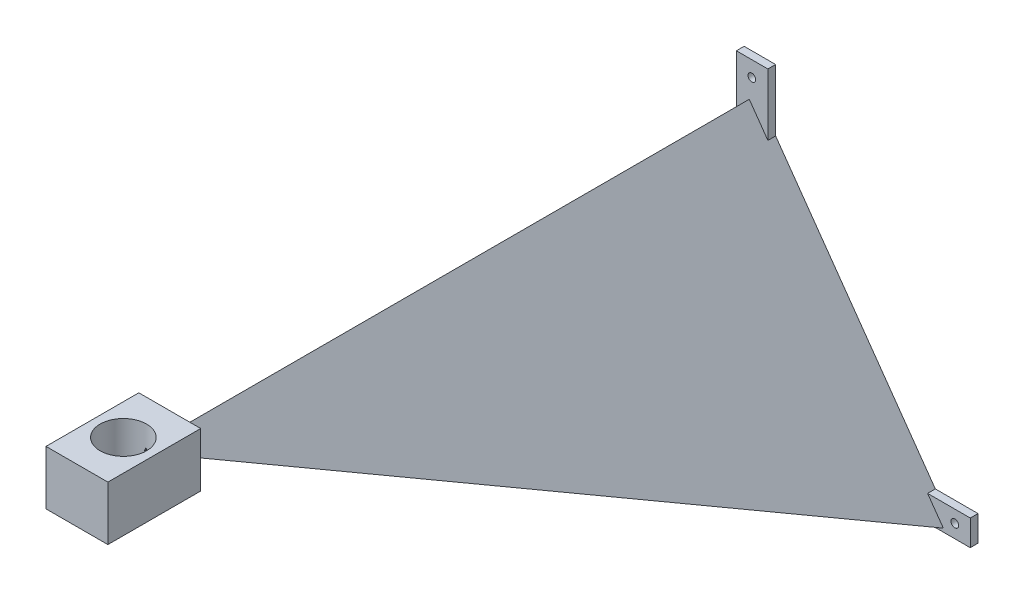
ISO-10303-21;
HEADER;
FILE_DESCRIPTION(('STEP AP214'),'2;1');
FILE_NAME('part.step','',(''),(''),'','','');
FILE_SCHEMA(('AUTOMOTIVE_DESIGN { 1 0 10303 214 1 1 1 1 }'));
ENDSEC;
DATA;
#1=APPLICATION_CONTEXT('core data for automotive mechanical design processes');
#2=APPLICATION_PROTOCOL_DEFINITION('international standard','automotive_design',2000,#1);
#3=PRODUCT_CONTEXT('',#1,'mechanical');
#4=PRODUCT('Part','Part','',(#3));
#5=PRODUCT_RELATED_PRODUCT_CATEGORY('part','',(#4));
#6=PRODUCT_DEFINITION_FORMATION('','',#4);
#7=PRODUCT_DEFINITION_CONTEXT('part definition',#1,'design');
#8=PRODUCT_DEFINITION('design','',#6,#7);
#9=PRODUCT_DEFINITION_SHAPE('','',#8);
#10=(LENGTH_UNIT() NAMED_UNIT(*) SI_UNIT(.MILLI.,.METRE.));
#11=(NAMED_UNIT(*) PLANE_ANGLE_UNIT() SI_UNIT($,.RADIAN.));
#12=(NAMED_UNIT(*) SI_UNIT($,.STERADIAN.) SOLID_ANGLE_UNIT());
#13=UNCERTAINTY_MEASURE_WITH_UNIT(LENGTH_MEASURE(1.E-05),#10,'distance_accuracy_value','');
#14=(GEOMETRIC_REPRESENTATION_CONTEXT(3) GLOBAL_UNCERTAINTY_ASSIGNED_CONTEXT((#13)) GLOBAL_UNIT_ASSIGNED_CONTEXT((#10,
#11,#12)) REPRESENTATION_CONTEXT('',''));
#15=CARTESIAN_POINT('',(0.,0.,0.));
#16=DIRECTION('',(0.,0.,1.));
#17=DIRECTION('',(1.,0.,0.));
#18=AXIS2_PLACEMENT_3D('',#15,#16,#17);
#19=CARTESIAN_POINT('',(-8.76166702832854,4.29092230853839,0.));
#20=DIRECTION('',(0.898083213266033,-0.439825581395349,0.));
#21=DIRECTION('',(0.439825581395349,0.898083213266033,0.));
#22=AXIS2_PLACEMENT_3D('',#19,#20,#21);
#23=PLANE('',#22);
#24=DIRECTION('',(-0.439825581395349,-0.898083213266033,0.));
#25=VECTOR('',#24,1.);
#26=CARTESIAN_POINT('',(-8.76166702832854,4.29092230853839,5.));
#27=LINE('',#26,#25);
#28=CARTESIAN_POINT('',(77.1020210409745,179.616642653207,5.));
#29=VERTEX_POINT('',#28);
#30=CARTESIAN_POINT('',(68.7675657637083,162.598454778634,5.));
#31=VERTEX_POINT('',#30);
#32=EDGE_CURVE('E307',#29,#31,#27,.T.);
#33=ORIENTED_EDGE('',*,*,#32,.T.);
#34=DIRECTION('',(0.,0.,-1.));
#35=VECTOR('',#34,1.);
#36=CARTESIAN_POINT('',(68.7675657637083,162.598454778634,0.));
#37=LINE('',#36,#35);
#38=CARTESIAN_POINT('',(68.7675657637083,162.598454778634,0.));
#39=VERTEX_POINT('',#38);
#40=EDGE_CURVE('E304',#31,#39,#37,.T.);
#41=ORIENTED_EDGE('',*,*,#40,.T.);
#42=DIRECTION('',(-0.439825581395349,-0.898083213266033,0.));
#43=VECTOR('',#42,1.);
#44=CARTESIAN_POINT('',(77.1020210409745,179.616642653207,0.));
#45=LINE('',#44,#43);
#46=CARTESIAN_POINT('',(-2.71970599897368,16.6280486722587,0.));
#47=VERTEX_POINT('',#46);
#48=EDGE_CURVE('E408',#39,#47,#45,.T.);
#49=ORIENTED_EDGE('',*,*,#48,.T.);
#50=DIRECTION('',(0.,0.,1.));
#51=VECTOR('',#50,1.);
#52=CARTESIAN_POINT('',(-2.71970599897367,16.6280486722587,0.));
#53=LINE('',#52,#51);
#54=CARTESIAN_POINT('',(-2.71970599897367,16.6280486722587,5.));
#55=VERTEX_POINT('',#54);
#56=EDGE_CURVE('E354',#47,#55,#53,.T.);
#57=ORIENTED_EDGE('',*,*,#56,.T.);
#58=DIRECTION('',(0.439825581395349,0.898083213266033,0.));
#59=VECTOR('',#58,1.);
#60=CARTESIAN_POINT('',(-8.76166702832854,4.29092230853839,5.));
#61=LINE('',#60,#59);
#62=CARTESIAN_POINT('',(-9.76353128460687,2.24520803316508,5.));
#63=VERTEX_POINT('',#62);
#64=EDGE_CURVE('E362',#63,#55,#61,.T.);
#65=ORIENTED_EDGE('',*,*,#64,.F.);
#66=DIRECTION('',(0.196695979648673,0.401635022862858,0.894427190999916));
#67=VECTOR('',#66,1.);
#68=CARTESIAN_POINT('',(-10.8630952380952,0.,0.));
#69=LINE('',#68,#67);
#70=CARTESIAN_POINT('',(72.7037652270211,170.635810520546,380.));
#71=VERTEX_POINT('',#70);
#72=EDGE_CURVE('E493',#63,#71,#69,.T.);
#73=ORIENTED_EDGE('',*,*,#72,.T.);
#74=DIRECTION('',(-0.439825581395349,-0.898083213266033,0.));
#75=VECTOR('',#74,1.);
#76=CARTESIAN_POINT('',(-8.76166702832853,4.29092230853838,380.));
#77=LINE('',#76,#75);
#78=CARTESIAN_POINT('',(77.1020210409745,179.616642653207,380.));
#79=VERTEX_POINT('',#78);
#80=EDGE_CURVE('E405',#79,#71,#77,.T.);
#81=ORIENTED_EDGE('',*,*,#80,.F.);
#82=DIRECTION('',(0.,0.,1.));
#83=VECTOR('',#82,1.);
#84=CARTESIAN_POINT('',(77.1020210409745,179.616642653207,0.));
#85=LINE('',#84,#83);
#86=EDGE_CURVE('E452',#29,#79,#85,.T.);
#87=ORIENTED_EDGE('',*,*,#86,.F.);
#88=EDGE_LOOP('',(#33,#41,#49,#57,#65,#73,#81,#87));
#89=FACE_BOUND('',#88,.T.);
#90=ADVANCED_FACE('F56',(#89),#23,.F.);
#91=CARTESIAN_POINT('',(136.072170604111,96.2378102329994,0.));
#92=DIRECTION('',(-0.816439284787303,-0.577431289640592,0.));
#93=DIRECTION('',(0.577431289640592,-0.816439284787303,0.));
#94=AXIS2_PLACEMENT_3D('',#91,#92,#93);
#95=PLANE('',#94);
#96=DIRECTION('',(-0.577431289640592,0.816439284787303,0.));
#97=VECTOR('',#96,1.);
#98=CARTESIAN_POINT('',(204.136904761905,0.,0.));
#99=LINE('',#98,#97);
#100=CARTESIAN_POINT('',(192.376623540834,16.6280486722587,0.));
#101=VERTEX_POINT('',#100);
#102=CARTESIAN_POINT('',(89.1382304136293,162.598454778634,0.));
#103=VERTEX_POINT('',#102);
#104=EDGE_CURVE('E490',#101,#103,#99,.T.);
#105=ORIENTED_EDGE('',*,*,#104,.T.);
#106=DIRECTION('',(0.,0.,-1.));
#107=VECTOR('',#106,1.);
#108=CARTESIAN_POINT('',(89.1382304136293,162.598454778634,5.));
#109=LINE('',#108,#107);
#110=CARTESIAN_POINT('',(89.1382304136293,162.598454778634,5.));
#111=VERTEX_POINT('',#110);
#112=EDGE_CURVE('E303',#111,#103,#109,.T.);
#113=ORIENTED_EDGE('',*,*,#112,.F.);
#114=DIRECTION('',(-0.577431289640592,0.816439284787303,0.));
#115=VECTOR('',#114,1.);
#116=CARTESIAN_POINT('',(136.072170604111,96.2378102329994,5.));
#117=LINE('',#116,#115);
#118=EDGE_CURVE('E506',#111,#29,#117,.T.);
#119=ORIENTED_EDGE('',*,*,#118,.T.);
#120=ORIENTED_EDGE('',*,*,#86,.T.);
#121=DIRECTION('',(-0.577431289640592,0.816439284787303,0.));
#122=VECTOR('',#121,1.);
#123=CARTESIAN_POINT('',(136.072170604111,96.2378102329994,380.));
#124=LINE('',#123,#122);
#125=CARTESIAN_POINT('',(83.4537652270211,170.635810520546,380.));
#126=VERTEX_POINT('',#125);
#127=EDGE_CURVE('E402',#126,#79,#124,.T.);
#128=ORIENTED_EDGE('',*,*,#127,.F.);
#129=DIRECTION('',(-0.278274965182918,0.39345739938957,0.876215908676647));
#130=VECTOR('',#129,1.);
#131=CARTESIAN_POINT('',(204.136904761905,0.,0.));
#132=LINE('',#131,#130);
#133=CARTESIAN_POINT('',(202.548968715393,2.24520803316508,5.));
#134=VERTEX_POINT('',#133);
#135=EDGE_CURVE('E470',#134,#126,#132,.T.);
#136=ORIENTED_EDGE('',*,*,#135,.F.);
#137=DIRECTION('',(-0.577431289640592,0.816439284787303,0.));
#138=VECTOR('',#137,1.);
#139=CARTESIAN_POINT('',(136.072170604111,96.2378102329994,5.));
#140=LINE('',#139,#138);
#141=CARTESIAN_POINT('',(192.376623540834,16.6280486722587,5.));
#142=VERTEX_POINT('',#141);
#143=EDGE_CURVE('E335',#134,#142,#140,.T.);
#144=ORIENTED_EDGE('',*,*,#143,.T.);
#145=DIRECTION('',(0.,0.,-1.));
#146=VECTOR('',#145,1.);
#147=CARTESIAN_POINT('',(192.376623540834,16.6280486722587,0.));
#148=LINE('',#147,#146);
#149=EDGE_CURVE('E327',#142,#101,#148,.T.);
#150=ORIENTED_EDGE('',*,*,#149,.T.);
#151=EDGE_LOOP('',(#105,#113,#119,#120,#128,#136,#144,#150));
#152=FACE_BOUND('',#151,.T.);
#153=ADVANCED_FACE('F415',(#152),#95,.F.);
#154=CARTESIAN_POINT('',(0.,0.,0.));
#155=DIRECTION('',(0.,0.912248393518791,-0.409637484274066));
#156=DIRECTION('',(0.,0.409637484274066,0.912248393518791));
#157=AXIS2_PLACEMENT_3D('',#154,#155,#156);
#158=PLANE('',#157);
#159=DIRECTION('',(1.,0.,0.));
#160=VECTOR('',#159,1.);
#161=CARTESIAN_POINT('',(-10.8630952380952,0.,0.));
#162=LINE('',#161,#160);
#163=CARTESIAN_POINT('',(15.1181601078167,0.,0.));
#164=VERTEX_POINT('',#163);
#165=CARTESIAN_POINT('',(169.956638215807,0.,0.));
#166=VERTEX_POINT('',#165);
#167=EDGE_CURVE('E474',#164,#166,#162,.T.);
#168=ORIENTED_EDGE('',*,*,#167,.T.);
#169=DIRECTION('',(0.,0.409637484274066,0.912248393518791));
#170=VECTOR('',#169,1.);
#171=CARTESIAN_POINT('',(169.956638215807,0.,0.));
#172=LINE('',#171,#170);
#173=CARTESIAN_POINT('',(169.956638215807,2.24520803316508,5.));
#174=VERTEX_POINT('',#173);
#175=EDGE_CURVE('E330',#166,#174,#172,.T.);
#176=ORIENTED_EDGE('',*,*,#175,.T.);
#177=DIRECTION('',(1.,0.,0.));
#178=VECTOR('',#177,1.);
#179=CARTESIAN_POINT('',(0.,2.24520803316508,5.));
#180=LINE('',#179,#178);
#181=EDGE_CURVE('E684',#174,#134,#180,.T.);
#182=ORIENTED_EDGE('',*,*,#181,.T.);
#183=ORIENTED_EDGE('',*,*,#135,.T.);
#184=DIRECTION('',(1.,0.,0.));
#185=VECTOR('',#184,1.);
#186=CARTESIAN_POINT('',(0.,170.635810520546,380.));
#187=LINE('',#186,#185);
#188=EDGE_CURVE('E461',#71,#126,#187,.T.);
#189=ORIENTED_EDGE('',*,*,#188,.F.);
#190=ORIENTED_EDGE('',*,*,#72,.F.);
#191=DIRECTION('',(-1.,0.,0.));
#192=VECTOR('',#191,1.);
#193=CARTESIAN_POINT('',(0.,2.24520803316508,5.));
#194=LINE('',#193,#192);
#195=CARTESIAN_POINT('',(15.1181601078167,2.24520803316508,5.));
#196=VERTEX_POINT('',#195);
#197=EDGE_CURVE('E469',#196,#63,#194,.T.);
#198=ORIENTED_EDGE('',*,*,#197,.F.);
#199=DIRECTION('',(0.,-0.409637484274066,-0.912248393518791));
#200=VECTOR('',#199,1.);
#201=CARTESIAN_POINT('',(15.1181601078167,0.,0.));
#202=LINE('',#201,#200);
#203=EDGE_CURVE('E357',#196,#164,#202,.T.);
#204=ORIENTED_EDGE('',*,*,#203,.T.);
#205=EDGE_LOOP('',(#168,#176,#182,#183,#189,#190,#198,#204));
#206=FACE_BOUND('',#205,.T.);
#207=ADVANCED_FACE('F58',(#206),#158,.F.);
#208=CARTESIAN_POINT('',(0.,0.,0.));
#209=DIRECTION('',(0.,0.,1.));
#210=DIRECTION('',(1.,0.,0.));
#211=AXIS2_PLACEMENT_3D('',#208,#209,#210);
#212=PLANE('',#211);
#213=DIRECTION('',(-0.12149434233348,-0.992592124077637,0.));
#214=VECTOR('',#213,1.);
#215=CARTESIAN_POINT('',(189.845048629633,15.8779632545048,0.));
#216=LINE('',#215,#214);
#217=CARTESIAN_POINT('',(189.845048629633,15.8779632545048,0.));
#218=VERTEX_POINT('',#217);
#219=CARTESIAN_POINT('',(188.207571555273,2.5,0.));
#220=VERTEX_POINT('',#219);
#221=EDGE_CURVE('E74',#218,#220,#216,.T.);
#222=ORIENTED_EDGE('',*,*,#221,.F.);
#223=DIRECTION('',(0.577431289640592,-0.816439284787303,0.));
#224=VECTOR('',#223,1.);
#225=CARTESIAN_POINT('',(189.845048629633,15.8779632545048,0.));
#226=LINE('',#225,#224);
#227=CARTESIAN_POINT('',(88.3733916218211,159.350353060755,0.));
#228=VERTEX_POINT('',#227);
#229=EDGE_CURVE('E238',#228,#218,#226,.T.);
#230=ORIENTED_EDGE('',*,*,#229,.F.);
#231=DIRECTION('',(0.999998989652521,-0.00142151114589162,0.));
#232=VECTOR('',#231,1.);
#233=CARTESIAN_POINT('',(69.9733624866885,159.376508933682,0.));
#234=LINE('',#233,#232);
#235=CARTESIAN_POINT('',(69.9733624866885,159.376508933682,0.));
#236=VERTEX_POINT('',#235);
#237=EDGE_CURVE('E244',#236,#228,#234,.T.);
#238=ORIENTED_EDGE('',*,*,#237,.F.);
#239=DIRECTION('',(0.439825581395349,0.898083213266033,0.));
#240=VECTOR('',#239,1.);
#241=CARTESIAN_POINT('',(69.9733624866885,159.376508933682,0.));
#242=LINE('',#241,#240);
#243=CARTESIAN_POINT('',(0.470951601625899,17.4590054101971,0.));
#244=VERTEX_POINT('',#243);
#245=EDGE_CURVE('E251',#244,#236,#242,.T.);
#246=ORIENTED_EDGE('',*,*,#245,.F.);
#247=DIRECTION('',(-0.21683089781014,0.976209179302699,0.));
#248=VECTOR('',#247,1.);
#249=CARTESIAN_POINT('',(0.47095160162589,17.4590054101971,0.));
#250=LINE('',#249,#248);
#251=CARTESIAN_POINT('',(3.7935740909541,2.5,0.));
#252=VERTEX_POINT('',#251);
#253=EDGE_CURVE('E260',#252,#244,#250,.T.);
#254=ORIENTED_EDGE('',*,*,#253,.F.);
#255=DIRECTION('',(-1.,0.,0.));
#256=VECTOR('',#255,1.);
#257=CARTESIAN_POINT('',(188.207571555273,2.5,0.));
#258=LINE('',#257,#256);
#259=EDGE_CURVE('E257',#220,#252,#258,.T.);
#260=ORIENTED_EDGE('',*,*,#259,.F.);
#261=EDGE_LOOP('',(#222,#230,#238,#246,#254,#260));
#262=FACE_BOUND('',#261,.T.);
#263=CARTESIAN_POINT('',(78.7675657637083,192.598454778634,0.));
#264=DIRECTION('',(0.,0.,-1.));
#265=DIRECTION('',(-1.,0.,0.));
#266=AXIS2_PLACEMENT_3D('',#263,#264,#265);
#267=CIRCLE('',#266,2.50000000000001);
#268=CARTESIAN_POINT('',(76.2675657637083,192.598454778634,0.));
#269=VERTEX_POINT('',#268);
#270=EDGE_CURVE('E268',#269,#269,#267,.T.);
#271=ORIENTED_EDGE('',*,*,#270,.F.);
#272=EDGE_LOOP('',(#271));
#273=FACE_BOUND('',#272,.T.);
#274=CARTESIAN_POINT('',(209.956638215807,8.62804867225871,0.));
#275=DIRECTION('',(0.,0.,1.));
#276=DIRECTION('',(1.,0.,0.));
#277=AXIS2_PLACEMENT_3D('',#274,#275,#276);
#278=CIRCLE('',#277,2.5);
#279=CARTESIAN_POINT('',(212.456638215807,8.62804867225871,0.));
#280=VERTEX_POINT('',#279);
#281=EDGE_CURVE('E276',#280,#280,#278,.T.);
#282=ORIENTED_EDGE('',*,*,#281,.T.);
#283=EDGE_LOOP('',(#282));
#284=FACE_BOUND('',#283,.T.);
#285=CARTESIAN_POINT('',(-24.8818398921833,8.62804867225871,0.));
#286=DIRECTION('',(0.,0.,1.));
#287=DIRECTION('',(1.,0.,0.));
#288=AXIS2_PLACEMENT_3D('',#285,#286,#287);
#289=CIRCLE('',#288,2.5);
#290=CARTESIAN_POINT('',(-22.3818398921833,8.62804867225871,0.));
#291=VERTEX_POINT('',#290);
#292=EDGE_CURVE('E282',#291,#291,#289,.T.);
#293=ORIENTED_EDGE('',*,*,#292,.T.);
#294=EDGE_LOOP('',(#293));
#295=FACE_BOUND('',#294,.T.);
#296=ORIENTED_EDGE('',*,*,#48,.F.);
#297=DIRECTION('',(0.,1.,0.));
#298=VECTOR('',#297,1.);
#299=CARTESIAN_POINT('',(68.7675657637083,162.598454778634,0.));
#300=LINE('',#299,#298);
#301=CARTESIAN_POINT('',(68.7675657637084,202.598454778634,0.));
#302=VERTEX_POINT('',#301);
#303=EDGE_CURVE('E289',#39,#302,#300,.T.);
#304=ORIENTED_EDGE('',*,*,#303,.T.);
#305=DIRECTION('',(1.,0.,0.));
#306=VECTOR('',#305,1.);
#307=CARTESIAN_POINT('',(68.7675657637084,202.598454778634,0.));
#308=LINE('',#307,#306);
#309=CARTESIAN_POINT('',(89.1382304136293,202.598454778634,0.));
#310=VERTEX_POINT('',#309);
#311=EDGE_CURVE('E286',#302,#310,#308,.T.);
#312=ORIENTED_EDGE('',*,*,#311,.T.);
#313=DIRECTION('',(0.,-1.,0.));
#314=VECTOR('',#313,1.);
#315=CARTESIAN_POINT('',(89.1382304136293,162.598454778634,0.));
#316=LINE('',#315,#314);
#317=EDGE_CURVE('E288',#310,#103,#316,.T.);
#318=ORIENTED_EDGE('',*,*,#317,.T.);
#319=ORIENTED_EDGE('',*,*,#104,.F.);
#320=DIRECTION('',(1.,0.,0.));
#321=VECTOR('',#320,1.);
#322=CARTESIAN_POINT('',(169.956638215807,16.6280486722587,0.));
#323=LINE('',#322,#321);
#324=CARTESIAN_POINT('',(219.956638215807,16.6280486722587,0.));
#325=VERTEX_POINT('',#324);
#326=EDGE_CURVE('E321',#101,#325,#323,.T.);
#327=ORIENTED_EDGE('',*,*,#326,.T.);
#328=DIRECTION('',(0.,-1.,0.));
#329=VECTOR('',#328,1.);
#330=CARTESIAN_POINT('',(219.956638215807,0.,0.));
#331=LINE('',#330,#329);
#332=CARTESIAN_POINT('',(219.956638215807,0.,0.));
#333=VERTEX_POINT('',#332);
#334=EDGE_CURVE('E318',#325,#333,#331,.T.);
#335=ORIENTED_EDGE('',*,*,#334,.T.);
#336=DIRECTION('',(-1.,0.,0.));
#337=VECTOR('',#336,1.);
#338=CARTESIAN_POINT('',(169.956638215807,0.,0.));
#339=LINE('',#338,#337);
#340=EDGE_CURVE('E324',#333,#166,#339,.T.);
#341=ORIENTED_EDGE('',*,*,#340,.T.);
#342=ORIENTED_EDGE('',*,*,#167,.F.);
#343=DIRECTION('',(-1.,0.,0.));
#344=VECTOR('',#343,1.);
#345=CARTESIAN_POINT('',(15.1181601078167,0.,0.));
#346=LINE('',#345,#344);
#347=CARTESIAN_POINT('',(-34.8818398921833,0.,0.));
#348=VERTEX_POINT('',#347);
#349=EDGE_CURVE('E343',#164,#348,#346,.T.);
#350=ORIENTED_EDGE('',*,*,#349,.T.);
#351=DIRECTION('',(0.,1.,0.));
#352=VECTOR('',#351,1.);
#353=CARTESIAN_POINT('',(-34.8818398921833,0.,0.));
#354=LINE('',#353,#352);
#355=CARTESIAN_POINT('',(-34.8818398921833,16.6280486722587,0.));
#356=VERTEX_POINT('',#355);
#357=EDGE_CURVE('E340',#348,#356,#354,.T.);
#358=ORIENTED_EDGE('',*,*,#357,.T.);
#359=DIRECTION('',(1.,0.,0.));
#360=VECTOR('',#359,1.);
#361=CARTESIAN_POINT('',(15.1181601078167,16.6280486722587,0.));
#362=LINE('',#361,#360);
#363=EDGE_CURVE('E342',#356,#47,#362,.T.);
#364=ORIENTED_EDGE('',*,*,#363,.T.);
#365=EDGE_LOOP('',(#296,#304,#312,#318,#319,#327,#335,#341,#342,#350,#358,#364));
#366=FACE_BOUND('',#365,.T.);
#367=ADVANCED_FACE('F253',(#262,#273,#284,#295,#366),#212,.F.);
#368=CARTESIAN_POINT('',(0.,0.,380.));
#369=DIRECTION('',(0.,0.,1.));
#370=DIRECTION('',(1.,0.,0.));
#371=AXIS2_PLACEMENT_3D('',#368,#369,#370);
#372=PLANE('',#371);
#373=DIRECTION('',(0.,1.,0.));
#374=VECTOR('',#373,1.);
#375=CARTESIAN_POINT('',(97.5,193.,380.));
#376=LINE('',#375,#374);
#377=CARTESIAN_POINT('',(97.5,158.,380.));
#378=VERTEX_POINT('',#377);
#379=CARTESIAN_POINT('',(97.5,193.,380.));
#380=VERTEX_POINT('',#379);
#381=EDGE_CURVE('E370',#378,#380,#376,.T.);
#382=ORIENTED_EDGE('',*,*,#381,.F.);
#383=DIRECTION('',(1.,0.,0.));
#384=VECTOR('',#383,1.);
#385=CARTESIAN_POINT('',(57.5,158.,380.));
#386=LINE('',#385,#384);
#387=CARTESIAN_POINT('',(57.5,158.,380.));
#388=VERTEX_POINT('',#387);
#389=EDGE_CURVE('E377',#388,#378,#386,.T.);
#390=ORIENTED_EDGE('',*,*,#389,.F.);
#391=DIRECTION('',(0.,-1.,0.));
#392=VECTOR('',#391,1.);
#393=CARTESIAN_POINT('',(57.5,193.,380.));
#394=LINE('',#393,#392);
#395=CARTESIAN_POINT('',(57.5,193.,380.));
#396=VERTEX_POINT('',#395);
#397=EDGE_CURVE('E388',#396,#388,#394,.T.);
#398=ORIENTED_EDGE('',*,*,#397,.F.);
#399=DIRECTION('',(-1.,0.,0.));
#400=VECTOR('',#399,1.);
#401=CARTESIAN_POINT('',(57.5,193.,380.));
#402=LINE('',#401,#400);
#403=EDGE_CURVE('E386',#380,#396,#402,.T.);
#404=ORIENTED_EDGE('',*,*,#403,.F.);
#405=EDGE_LOOP('',(#382,#390,#398,#404));
#406=FACE_BOUND('',#405,.T.);
#407=ORIENTED_EDGE('',*,*,#127,.T.);
#408=ORIENTED_EDGE('',*,*,#80,.T.);
#409=ORIENTED_EDGE('',*,*,#188,.T.);
#410=EDGE_LOOP('',(#407,#408,#409));
#411=FACE_BOUND('',#410,.T.);
#412=ADVANCED_FACE('F640',(#406,#411),#372,.F.);
#413=CARTESIAN_POINT('',(97.5,193.,440.));
#414=DIRECTION('',(-1.,0.,0.));
#415=DIRECTION('',(0.,0.,1.));
#416=AXIS2_PLACEMENT_3D('',#413,#414,#415);
#417=PLANE('',#416);
#418=ORIENTED_EDGE('',*,*,#381,.T.);
#419=DIRECTION('',(0.,0.,-1.));
#420=VECTOR('',#419,1.);
#421=CARTESIAN_POINT('',(97.5,193.,440.));
#422=LINE('',#421,#420);
#423=CARTESIAN_POINT('',(97.5,193.,440.));
#424=VERTEX_POINT('',#423);
#425=EDGE_CURVE('E399',#424,#380,#422,.T.);
#426=ORIENTED_EDGE('',*,*,#425,.F.);
#427=DIRECTION('',(0.,1.,0.));
#428=VECTOR('',#427,1.);
#429=CARTESIAN_POINT('',(97.5,193.,440.));
#430=LINE('',#429,#428);
#431=CARTESIAN_POINT('',(97.5,158.,440.));
#432=VERTEX_POINT('',#431);
#433=EDGE_CURVE('E373',#432,#424,#430,.T.);
#434=ORIENTED_EDGE('',*,*,#433,.F.);
#435=DIRECTION('',(0.,0.,-1.));
#436=VECTOR('',#435,1.);
#437=CARTESIAN_POINT('',(97.5,158.,440.));
#438=LINE('',#437,#436);
#439=EDGE_CURVE('E383',#432,#378,#438,.T.);
#440=ORIENTED_EDGE('',*,*,#439,.T.);
#441=EDGE_LOOP('',(#418,#426,#434,#440));
#442=FACE_BOUND('',#441,.T.);
#443=ADVANCED_FACE('F643',(#442),#417,.F.);
#444=CARTESIAN_POINT('',(57.5,193.,440.));
#445=DIRECTION('',(0.,-1.,0.));
#446=DIRECTION('',(0.,0.,-1.));
#447=AXIS2_PLACEMENT_3D('',#444,#445,#446);
#448=PLANE('',#447);
#449=CARTESIAN_POINT('',(77.5,193.,410.));
#450=DIRECTION('',(0.,1.,0.));
#451=DIRECTION('',(0.,0.,1.));
#452=AXIS2_PLACEMENT_3D('',#449,#450,#451);
#453=CIRCLE('',#452,15.);
#454=CARTESIAN_POINT('',(77.5,193.,425.));
#455=VERTEX_POINT('',#454);
#456=EDGE_CURVE('E366',#455,#455,#453,.T.);
#457=ORIENTED_EDGE('',*,*,#456,.F.);
#458=EDGE_LOOP('',(#457));
#459=FACE_BOUND('',#458,.T.);
#460=ORIENTED_EDGE('',*,*,#403,.T.);
#461=DIRECTION('',(0.,0.,-1.));
#462=VECTOR('',#461,1.);
#463=CARTESIAN_POINT('',(57.5,193.,440.));
#464=LINE('',#463,#462);
#465=CARTESIAN_POINT('',(57.5,193.,440.));
#466=VERTEX_POINT('',#465);
#467=EDGE_CURVE('E396',#466,#396,#464,.T.);
#468=ORIENTED_EDGE('',*,*,#467,.F.);
#469=DIRECTION('',(-1.,0.,0.));
#470=VECTOR('',#469,1.);
#471=CARTESIAN_POINT('',(57.5,193.,440.));
#472=LINE('',#471,#470);
#473=EDGE_CURVE('E376',#424,#466,#472,.T.);
#474=ORIENTED_EDGE('',*,*,#473,.F.);
#475=ORIENTED_EDGE('',*,*,#425,.T.);
#476=EDGE_LOOP('',(#460,#468,#474,#475));
#477=FACE_BOUND('',#476,.T.);
#478=ADVANCED_FACE('F651',(#459,#477),#448,.F.);
#479=CARTESIAN_POINT('',(57.5,193.,440.));
#480=DIRECTION('',(1.,0.,0.));
#481=DIRECTION('',(0.,0.,-1.));
#482=AXIS2_PLACEMENT_3D('',#479,#480,#481);
#483=PLANE('',#482);
#484=ORIENTED_EDGE('',*,*,#397,.T.);
#485=DIRECTION('',(0.,0.,-1.));
#486=VECTOR('',#485,1.);
#487=CARTESIAN_POINT('',(57.5,158.,440.));
#488=LINE('',#487,#486);
#489=CARTESIAN_POINT('',(57.5,158.,440.));
#490=VERTEX_POINT('',#489);
#491=EDGE_CURVE('E393',#490,#388,#488,.T.);
#492=ORIENTED_EDGE('',*,*,#491,.F.);
#493=DIRECTION('',(0.,-1.,0.));
#494=VECTOR('',#493,1.);
#495=CARTESIAN_POINT('',(57.5,193.,440.));
#496=LINE('',#495,#494);
#497=EDGE_CURVE('E379',#466,#490,#496,.T.);
#498=ORIENTED_EDGE('',*,*,#497,.F.);
#499=ORIENTED_EDGE('',*,*,#467,.T.);
#500=EDGE_LOOP('',(#484,#492,#498,#499));
#501=FACE_BOUND('',#500,.T.);
#502=ADVANCED_FACE('F647',(#501),#483,.F.);
#503=CARTESIAN_POINT('',(57.5,158.,440.));
#504=DIRECTION('',(0.,1.,0.));
#505=DIRECTION('',(0.,0.,1.));
#506=AXIS2_PLACEMENT_3D('',#503,#504,#505);
#507=PLANE('',#506);
#508=ORIENTED_EDGE('',*,*,#389,.T.);
#509=ORIENTED_EDGE('',*,*,#439,.F.);
#510=DIRECTION('',(1.,0.,0.));
#511=VECTOR('',#510,1.);
#512=CARTESIAN_POINT('',(57.5,158.,440.));
#513=LINE('',#512,#511);
#514=EDGE_CURVE('E381',#490,#432,#513,.T.);
#515=ORIENTED_EDGE('',*,*,#514,.F.);
#516=ORIENTED_EDGE('',*,*,#491,.T.);
#517=EDGE_LOOP('',(#508,#509,#515,#516));
#518=FACE_BOUND('',#517,.T.);
#519=ADVANCED_FACE('F638',(#518),#507,.F.);
#520=CARTESIAN_POINT('',(0.,0.,440.));
#521=DIRECTION('',(0.,0.,1.));
#522=DIRECTION('',(1.,0.,0.));
#523=AXIS2_PLACEMENT_3D('',#520,#521,#522);
#524=PLANE('',#523);
#525=ORIENTED_EDGE('',*,*,#433,.T.);
#526=ORIENTED_EDGE('',*,*,#473,.T.);
#527=ORIENTED_EDGE('',*,*,#497,.T.);
#528=ORIENTED_EDGE('',*,*,#514,.T.);
#529=EDGE_LOOP('',(#525,#526,#527,#528));
#530=FACE_BOUND('',#529,.T.);
#531=ADVANCED_FACE('F634',(#530),#524,.T.);
#532=CARTESIAN_POINT('',(77.5,163.,410.));
#533=DIRECTION('',(0.,1.,0.));
#534=DIRECTION('',(0.,0.,1.));
#535=AXIS2_PLACEMENT_3D('',#532,#533,#534);
#536=CYLINDRICAL_SURFACE('',#535,15.);
#537=CARTESIAN_POINT('',(77.5,180.122333601043,410.));
#538=DIRECTION('',(0.00141969300681462,0.998719972428274,-0.0505608657425147));
#539=DIRECTION('',(-0.0280319002929486,0.0505807935175616,0.998326497641478));
#540=AXIS2_PLACEMENT_3D('',#537,#538,#539);
#541=ELLIPSE('',#540,15.0192250221343,15.);
#542=CARTESIAN_POINT('',(77.0130537065054,179.364041026601,395.007905973239));
#543=VERTEX_POINT('',#542);
#544=CARTESIAN_POINT('',(77.2428510581795,179.363425718184,395.002204347915));
#545=VERTEX_POINT('',#544);
#546=EDGE_CURVE('E512',#543,#545,#541,.F.);
#547=ORIENTED_EDGE('',*,*,#546,.T.);
#548=CARTESIAN_POINT('',(77.5,179.162171859235,410.));
#549=DIRECTION('',(0.816423339174677,0.577420012016114,-0.00624987793326378));
#550=DIRECTION('',(-0.577403093783345,0.816447260833981,0.0044201319110779));
#551=AXIS2_PLACEMENT_3D('',#548,#549,#550);
#552=ELLIPSE('',#551,25.9776240654115,15.);
#553=CARTESIAN_POINT('',(78.5018679599287,177.583620383252,395.033495378317));
#554=VERTEX_POINT('',#553);
#555=EDGE_CURVE('E12',#545,#554,#552,.F.);
#556=ORIENTED_EDGE('',*,*,#555,.T.);
#557=CARTESIAN_POINT('',(77.5,209.988920236968,410.));
#558=DIRECTION('',(0.942733281523966,-0.115391566441322,0.312951667676133));
#559=DIRECTION('',(0.109515021394026,0.99332008254853,0.0363548304197391));
#560=AXIS2_PLACEMENT_3D('',#557,#558,#559);
#561=ELLIPSE('',#560,129.992168947872,15.);
#562=CARTESIAN_POINT('',(78.4819041036348,177.416930269972,395.032172357644));
#563=VERTEX_POINT('',#562);
#564=EDGE_CURVE('E66',#554,#563,#561,.F.);
#565=ORIENTED_EDGE('',*,*,#564,.T.);
#566=CARTESIAN_POINT('',(77.5,184.044558719537,410.));
#567=DIRECTION('',(0.,-0.914371574945137,0.404876058729519));
#568=DIRECTION('',(0.,0.404876058729519,0.914371574945137));
#569=AXIS2_PLACEMENT_3D('',#566,#567,#568);
#570=ELLIPSE('',#569,16.4047094321584,15.);
#571=CARTESIAN_POINT('',(76.1960719096769,177.427827104305,395.056781754412));
#572=VERTEX_POINT('',#571);
#573=EDGE_CURVE('E502',#563,#572,#570,.F.);
#574=ORIENTED_EDGE('',*,*,#573,.T.);
#575=CARTESIAN_POINT('',(77.5,190.503964514565,410.));
#576=DIRECTION('',(-0.941284960121744,-0.209073697856608,0.265086424988476));
#577=DIRECTION('',(-0.201245475103367,0.977899886933506,0.0566751258124417));
#578=AXIS2_PLACEMENT_3D('',#575,#576,#577);
#579=ELLIPSE('',#578,71.7450360986473,15.);
#580=CARTESIAN_POINT('',(76.1556962746599,177.614141718627,395.060359860625));
#581=VERTEX_POINT('',#580);
#582=EDGE_CURVE('E505',#572,#581,#579,.F.);
#583=ORIENTED_EDGE('',*,*,#582,.T.);
#584=CARTESIAN_POINT('',(77.5,180.571380713239,410.));
#585=DIRECTION('',(-0.898065673092145,0.439816991303624,-0.0062498779332636));
#586=DIRECTION('',(0.439806341217739,0.898087420110441,0.00306072933109884));
#587=AXIS2_PLACEMENT_3D('',#584,#585,#586);
#588=ELLIPSE('',#587,34.1050943837794,15.);
#589=EDGE_CURVE('E509',#581,#543,#588,.F.);
#590=ORIENTED_EDGE('',*,*,#589,.T.);
#591=EDGE_LOOP('',(#547,#556,#565,#574,#583,#590));
#592=FACE_BOUND('',#591,.T.);
#593=CARTESIAN_POINT('',(77.5,163.,410.));
#594=DIRECTION('',(0.,1.,0.));
#595=DIRECTION('',(0.,0.,1.));
#596=AXIS2_PLACEMENT_3D('',#593,#594,#595);
#597=CIRCLE('',#596,15.);
#598=CARTESIAN_POINT('',(77.5,163.,425.));
#599=VERTEX_POINT('',#598);
#600=EDGE_CURVE('E367',#599,#599,#597,.T.);
#601=ORIENTED_EDGE('',*,*,#600,.F.);
#602=EDGE_LOOP('',(#601));
#603=FACE_BOUND('',#602,.T.);
#604=ORIENTED_EDGE('',*,*,#456,.T.);
#605=EDGE_LOOP('',(#604));
#606=FACE_BOUND('',#605,.T.);
#607=ADVANCED_FACE('F630',(#592,#603,#606),#536,.F.);
#608=CARTESIAN_POINT('',(77.5,163.,410.));
#609=DIRECTION('',(0.,1.,0.));
#610=DIRECTION('',(0.,0.,1.));
#611=AXIS2_PLACEMENT_3D('',#608,#609,#610);
#612=PLANE('',#611);
#613=ORIENTED_EDGE('',*,*,#600,.T.);
#614=EDGE_LOOP('',(#613));
#615=FACE_BOUND('',#614,.T.);
#616=ADVANCED_FACE('F620',(#615),#612,.T.);
#617=CARTESIAN_POINT('',(15.1181601078167,16.6280486722587,0.));
#618=DIRECTION('',(0.,-1.,0.));
#619=DIRECTION('',(0.,0.,-1.));
#620=AXIS2_PLACEMENT_3D('',#617,#618,#619);
#621=PLANE('',#620);
#622=DIRECTION('',(1.,0.,0.));
#623=VECTOR('',#622,1.);
#624=CARTESIAN_POINT('',(15.1181601078167,16.6280486722587,5.));
#625=LINE('',#624,#623);
#626=CARTESIAN_POINT('',(-34.8818398921833,16.6280486722587,5.));
#627=VERTEX_POINT('',#626);
#628=EDGE_CURVE('E758',#627,#55,#625,.T.);
#629=ORIENTED_EDGE('',*,*,#628,.T.);
#630=ORIENTED_EDGE('',*,*,#56,.F.);
#631=ORIENTED_EDGE('',*,*,#363,.F.);
#632=DIRECTION('',(0.,0.,1.));
#633=VECTOR('',#632,1.);
#634=CARTESIAN_POINT('',(-34.8818398921833,16.6280486722587,0.));
#635=LINE('',#634,#633);
#636=EDGE_CURVE('E743',#356,#627,#635,.T.);
#637=ORIENTED_EDGE('',*,*,#636,.T.);
#638=EDGE_LOOP('',(#629,#630,#631,#637));
#639=FACE_BOUND('',#638,.T.);
#640=ADVANCED_FACE('F616',(#639),#621,.F.);
#641=CARTESIAN_POINT('',(15.1181601078167,0.,0.));
#642=DIRECTION('',(-1.,0.,0.));
#643=DIRECTION('',(0.,0.,1.));
#644=AXIS2_PLACEMENT_3D('',#641,#642,#643);
#645=PLANE('',#644);
#646=DIRECTION('',(0.,0.,1.));
#647=VECTOR('',#646,1.);
#648=CARTESIAN_POINT('',(15.1181601078167,0.,0.));
#649=LINE('',#648,#647);
#650=CARTESIAN_POINT('',(15.1181601078167,0.,5.));
#651=VERTEX_POINT('',#650);
#652=EDGE_CURVE('E351',#164,#651,#649,.T.);
#653=ORIENTED_EDGE('',*,*,#652,.F.);
#654=ORIENTED_EDGE('',*,*,#203,.F.);
#655=DIRECTION('',(0.,-1.,0.));
#656=VECTOR('',#655,1.);
#657=CARTESIAN_POINT('',(15.1181601078167,0.,5.));
#658=LINE('',#657,#656);
#659=EDGE_CURVE('E738',#196,#651,#658,.T.);
#660=ORIENTED_EDGE('',*,*,#659,.T.);
#661=EDGE_LOOP('',(#653,#654,#660));
#662=FACE_BOUND('',#661,.T.);
#663=ADVANCED_FACE('F612',(#662),#645,.F.);
#664=CARTESIAN_POINT('',(0.,0.,5.));
#665=DIRECTION('',(0.,0.,-1.));
#666=DIRECTION('',(-1.,0.,0.));
#667=AXIS2_PLACEMENT_3D('',#664,#665,#666);
#668=PLANE('',#667);
#669=CARTESIAN_POINT('',(-24.8818398921833,8.62804867225871,5.));
#670=DIRECTION('',(0.,0.,1.));
#671=DIRECTION('',(1.,0.,0.));
#672=AXIS2_PLACEMENT_3D('',#669,#670,#671);
#673=CIRCLE('',#672,2.5);
#674=CARTESIAN_POINT('',(-22.3818398921833,8.62804867225871,5.));
#675=VERTEX_POINT('',#674);
#676=EDGE_CURVE('E277',#675,#675,#673,.T.);
#677=ORIENTED_EDGE('',*,*,#676,.F.);
#678=EDGE_LOOP('',(#677));
#679=FACE_BOUND('',#678,.T.);
#680=ORIENTED_EDGE('',*,*,#197,.T.);
#681=ORIENTED_EDGE('',*,*,#64,.T.);
#682=ORIENTED_EDGE('',*,*,#628,.F.);
#683=DIRECTION('',(0.,1.,0.));
#684=VECTOR('',#683,1.);
#685=CARTESIAN_POINT('',(-34.8818398921833,0.,5.));
#686=LINE('',#685,#684);
#687=CARTESIAN_POINT('',(-34.8818398921833,0.,5.));
#688=VERTEX_POINT('',#687);
#689=EDGE_CURVE('E757',#688,#627,#686,.T.);
#690=ORIENTED_EDGE('',*,*,#689,.F.);
#691=DIRECTION('',(-1.,0.,0.));
#692=VECTOR('',#691,1.);
#693=CARTESIAN_POINT('',(15.1181601078167,0.,5.));
#694=LINE('',#693,#692);
#695=EDGE_CURVE('E339',#651,#688,#694,.T.);
#696=ORIENTED_EDGE('',*,*,#695,.F.);
#697=ORIENTED_EDGE('',*,*,#659,.F.);
#698=EDGE_LOOP('',(#680,#681,#682,#690,#696,#697));
#699=FACE_BOUND('',#698,.T.);
#700=ADVANCED_FACE('F608',(#679,#699),#668,.F.);
#701=CARTESIAN_POINT('',(15.1181601078167,0.,0.));
#702=DIRECTION('',(0.,1.,0.));
#703=DIRECTION('',(-1.,0.,0.));
#704=AXIS2_PLACEMENT_3D('',#701,#702,#703);
#705=PLANE('',#704);
#706=ORIENTED_EDGE('',*,*,#695,.T.);
#707=DIRECTION('',(0.,0.,1.));
#708=VECTOR('',#707,1.);
#709=CARTESIAN_POINT('',(-34.8818398921833,0.,0.));
#710=LINE('',#709,#708);
#711=EDGE_CURVE('E352',#348,#688,#710,.T.);
#712=ORIENTED_EDGE('',*,*,#711,.F.);
#713=ORIENTED_EDGE('',*,*,#349,.F.);
#714=ORIENTED_EDGE('',*,*,#652,.T.);
#715=EDGE_LOOP('',(#706,#712,#713,#714));
#716=FACE_BOUND('',#715,.T.);
#717=ADVANCED_FACE('F611',(#716),#705,.F.);
#718=CARTESIAN_POINT('',(-34.8818398921833,0.,0.));
#719=DIRECTION('',(1.,0.,0.));
#720=DIRECTION('',(0.,0.,-1.));
#721=AXIS2_PLACEMENT_3D('',#718,#719,#720);
#722=PLANE('',#721);
#723=ORIENTED_EDGE('',*,*,#689,.T.);
#724=ORIENTED_EDGE('',*,*,#636,.F.);
#725=ORIENTED_EDGE('',*,*,#357,.F.);
#726=ORIENTED_EDGE('',*,*,#711,.T.);
#727=EDGE_LOOP('',(#723,#724,#725,#726));
#728=FACE_BOUND('',#727,.T.);
#729=ADVANCED_FACE('F600',(#728),#722,.F.);
#730=CARTESIAN_POINT('',(169.956638215807,16.6280486722587,0.));
#731=DIRECTION('',(0.,-1.,0.));
#732=DIRECTION('',(1.,0.,0.));
#733=AXIS2_PLACEMENT_3D('',#730,#731,#732);
#734=PLANE('',#733);
#735=ORIENTED_EDGE('',*,*,#326,.F.);
#736=ORIENTED_EDGE('',*,*,#149,.F.);
#737=DIRECTION('',(1.,0.,0.));
#738=VECTOR('',#737,1.);
#739=CARTESIAN_POINT('',(169.956638215807,16.6280486722587,5.));
#740=LINE('',#739,#738);
#741=CARTESIAN_POINT('',(219.956638215807,16.6280486722587,5.));
#742=VERTEX_POINT('',#741);
#743=EDGE_CURVE('E717',#142,#742,#740,.T.);
#744=ORIENTED_EDGE('',*,*,#743,.T.);
#745=DIRECTION('',(0.,0.,1.));
#746=VECTOR('',#745,1.);
#747=CARTESIAN_POINT('',(219.956638215807,16.6280486722587,0.));
#748=LINE('',#747,#746);
#749=EDGE_CURVE('E325',#325,#742,#748,.T.);
#750=ORIENTED_EDGE('',*,*,#749,.F.);
#751=EDGE_LOOP('',(#735,#736,#744,#750));
#752=FACE_BOUND('',#751,.T.);
#753=ADVANCED_FACE('F597',(#752),#734,.F.);
#754=CARTESIAN_POINT('',(169.956638215807,0.,0.));
#755=DIRECTION('',(1.,0.,0.));
#756=DIRECTION('',(0.,0.,-1.));
#757=AXIS2_PLACEMENT_3D('',#754,#755,#756);
#758=PLANE('',#757);
#759=DIRECTION('',(0.,1.,0.));
#760=VECTOR('',#759,1.);
#761=CARTESIAN_POINT('',(169.956638215807,0.,5.));
#762=LINE('',#761,#760);
#763=CARTESIAN_POINT('',(169.956638215807,0.,5.));
#764=VERTEX_POINT('',#763);
#765=EDGE_CURVE('E719',#764,#174,#762,.T.);
#766=ORIENTED_EDGE('',*,*,#765,.T.);
#767=ORIENTED_EDGE('',*,*,#175,.F.);
#768=DIRECTION('',(0.,0.,1.));
#769=VECTOR('',#768,1.);
#770=CARTESIAN_POINT('',(169.956638215807,0.,0.));
#771=LINE('',#770,#769);
#772=EDGE_CURVE('E331',#166,#764,#771,.T.);
#773=ORIENTED_EDGE('',*,*,#772,.T.);
#774=EDGE_LOOP('',(#766,#767,#773));
#775=FACE_BOUND('',#774,.T.);
#776=ADVANCED_FACE('F592',(#775),#758,.F.);
#777=CARTESIAN_POINT('',(0.,0.,5.));
#778=DIRECTION('',(0.,0.,1.));
#779=DIRECTION('',(1.,0.,0.));
#780=AXIS2_PLACEMENT_3D('',#777,#778,#779);
#781=PLANE('',#780);
#782=CARTESIAN_POINT('',(209.956638215807,8.62804867225871,5.));
#783=DIRECTION('',(0.,0.,1.));
#784=DIRECTION('',(1.,0.,0.));
#785=AXIS2_PLACEMENT_3D('',#782,#783,#784);
#786=CIRCLE('',#785,2.5);
#787=CARTESIAN_POINT('',(212.456638215807,8.62804867225871,5.));
#788=VERTEX_POINT('',#787);
#789=EDGE_CURVE('E273',#788,#788,#786,.T.);
#790=ORIENTED_EDGE('',*,*,#789,.F.);
#791=EDGE_LOOP('',(#790));
#792=FACE_BOUND('',#791,.T.);
#793=ORIENTED_EDGE('',*,*,#143,.F.);
#794=ORIENTED_EDGE('',*,*,#181,.F.);
#795=ORIENTED_EDGE('',*,*,#765,.F.);
#796=DIRECTION('',(-1.,0.,0.));
#797=VECTOR('',#796,1.);
#798=CARTESIAN_POINT('',(169.956638215807,0.,5.));
#799=LINE('',#798,#797);
#800=CARTESIAN_POINT('',(219.956638215807,0.,5.));
#801=VERTEX_POINT('',#800);
#802=EDGE_CURVE('E315',#801,#764,#799,.T.);
#803=ORIENTED_EDGE('',*,*,#802,.F.);
#804=DIRECTION('',(0.,-1.,0.));
#805=VECTOR('',#804,1.);
#806=CARTESIAN_POINT('',(219.956638215807,0.,5.));
#807=LINE('',#806,#805);
#808=EDGE_CURVE('E700',#742,#801,#807,.T.);
#809=ORIENTED_EDGE('',*,*,#808,.F.);
#810=ORIENTED_EDGE('',*,*,#743,.F.);
#811=EDGE_LOOP('',(#793,#794,#795,#803,#809,#810));
#812=FACE_BOUND('',#811,.T.);
#813=ADVANCED_FACE('F588',(#792,#812),#781,.T.);
#814=CARTESIAN_POINT('',(169.956638215807,0.,0.));
#815=DIRECTION('',(0.,1.,0.));
#816=DIRECTION('',(-1.,0.,0.));
#817=AXIS2_PLACEMENT_3D('',#814,#815,#816);
#818=PLANE('',#817);
#819=ORIENTED_EDGE('',*,*,#802,.T.);
#820=ORIENTED_EDGE('',*,*,#772,.F.);
#821=ORIENTED_EDGE('',*,*,#340,.F.);
#822=DIRECTION('',(0.,0.,1.));
#823=VECTOR('',#822,1.);
#824=CARTESIAN_POINT('',(219.956638215807,0.,0.));
#825=LINE('',#824,#823);
#826=EDGE_CURVE('E707',#333,#801,#825,.T.);
#827=ORIENTED_EDGE('',*,*,#826,.T.);
#828=EDGE_LOOP('',(#819,#820,#821,#827));
#829=FACE_BOUND('',#828,.T.);
#830=ADVANCED_FACE('F591',(#829),#818,.F.);
#831=CARTESIAN_POINT('',(219.956638215807,0.,0.));
#832=DIRECTION('',(-1.,0.,0.));
#833=DIRECTION('',(0.,0.,1.));
#834=AXIS2_PLACEMENT_3D('',#831,#832,#833);
#835=PLANE('',#834);
#836=ORIENTED_EDGE('',*,*,#808,.T.);
#837=ORIENTED_EDGE('',*,*,#826,.F.);
#838=ORIENTED_EDGE('',*,*,#334,.F.);
#839=ORIENTED_EDGE('',*,*,#749,.T.);
#840=EDGE_LOOP('',(#836,#837,#838,#839));
#841=FACE_BOUND('',#840,.T.);
#842=ADVANCED_FACE('F576',(#841),#835,.F.);
#843=CARTESIAN_POINT('',(0.,0.,5.));
#844=DIRECTION('',(0.,0.,-1.));
#845=DIRECTION('',(-1.,0.,0.));
#846=AXIS2_PLACEMENT_3D('',#843,#844,#845);
#847=PLANE('',#846);
#848=CARTESIAN_POINT('',(78.7675657637083,192.598454778634,5.));
#849=DIRECTION('',(0.,0.,-1.));
#850=DIRECTION('',(-1.,0.,0.));
#851=AXIS2_PLACEMENT_3D('',#848,#849,#850);
#852=CIRCLE('',#851,2.50000000000001);
#853=CARTESIAN_POINT('',(76.2675657637083,192.598454778634,5.));
#854=VERTEX_POINT('',#853);
#855=EDGE_CURVE('E271',#854,#854,#852,.T.);
#856=ORIENTED_EDGE('',*,*,#855,.T.);
#857=EDGE_LOOP('',(#856));
#858=FACE_BOUND('',#857,.T.);
#859=DIRECTION('',(0.,1.,0.));
#860=VECTOR('',#859,1.);
#861=CARTESIAN_POINT('',(68.7675657637083,162.598454778634,5.));
#862=LINE('',#861,#860);
#863=CARTESIAN_POINT('',(68.7675657637084,202.598454778634,5.));
#864=VERTEX_POINT('',#863);
#865=EDGE_CURVE('E285',#31,#864,#862,.T.);
#866=ORIENTED_EDGE('',*,*,#865,.F.);
#867=ORIENTED_EDGE('',*,*,#32,.F.);
#868=ORIENTED_EDGE('',*,*,#118,.F.);
#869=DIRECTION('',(0.,-1.,0.));
#870=VECTOR('',#869,1.);
#871=CARTESIAN_POINT('',(89.1382304136293,162.598454778634,5.));
#872=LINE('',#871,#870);
#873=CARTESIAN_POINT('',(89.1382304136293,202.598454778634,5.));
#874=VERTEX_POINT('',#873);
#875=EDGE_CURVE('E294',#874,#111,#872,.T.);
#876=ORIENTED_EDGE('',*,*,#875,.F.);
#877=DIRECTION('',(1.,0.,0.));
#878=VECTOR('',#877,1.);
#879=CARTESIAN_POINT('',(68.7675657637084,202.598454778634,5.));
#880=LINE('',#879,#878);
#881=EDGE_CURVE('E292',#864,#874,#880,.T.);
#882=ORIENTED_EDGE('',*,*,#881,.F.);
#883=EDGE_LOOP('',(#866,#867,#868,#876,#882));
#884=FACE_BOUND('',#883,.T.);
#885=ADVANCED_FACE('F572',(#858,#884),#847,.F.);
#886=CARTESIAN_POINT('',(68.7675657637083,162.598454778634,0.));
#887=DIRECTION('',(1.,0.,0.));
#888=DIRECTION('',(0.,1.,0.));
#889=AXIS2_PLACEMENT_3D('',#886,#887,#888);
#890=PLANE('',#889);
#891=ORIENTED_EDGE('',*,*,#865,.T.);
#892=DIRECTION('',(0.,0.,1.));
#893=VECTOR('',#892,1.);
#894=CARTESIAN_POINT('',(68.7675657637084,202.598454778634,0.));
#895=LINE('',#894,#893);
#896=EDGE_CURVE('E300',#302,#864,#895,.T.);
#897=ORIENTED_EDGE('',*,*,#896,.F.);
#898=ORIENTED_EDGE('',*,*,#303,.F.);
#899=ORIENTED_EDGE('',*,*,#40,.F.);
#900=EDGE_LOOP('',(#891,#897,#898,#899));
#901=FACE_BOUND('',#900,.T.);
#902=ADVANCED_FACE('F575',(#901),#890,.F.);
#903=CARTESIAN_POINT('',(68.7675657637084,202.598454778634,0.));
#904=DIRECTION('',(0.,-1.,0.));
#905=DIRECTION('',(0.,0.,-1.));
#906=AXIS2_PLACEMENT_3D('',#903,#904,#905);
#907=PLANE('',#906);
#908=ORIENTED_EDGE('',*,*,#881,.T.);
#909=DIRECTION('',(0.,0.,1.));
#910=VECTOR('',#909,1.);
#911=CARTESIAN_POINT('',(89.1382304136293,202.598454778634,0.));
#912=LINE('',#911,#910);
#913=EDGE_CURVE('E297',#310,#874,#912,.T.);
#914=ORIENTED_EDGE('',*,*,#913,.F.);
#915=ORIENTED_EDGE('',*,*,#311,.F.);
#916=ORIENTED_EDGE('',*,*,#896,.T.);
#917=EDGE_LOOP('',(#908,#914,#915,#916));
#918=FACE_BOUND('',#917,.T.);
#919=ADVANCED_FACE('F580',(#918),#907,.F.);
#920=CARTESIAN_POINT('',(89.1382304136293,162.598454778634,0.));
#921=DIRECTION('',(-1.,0.,0.));
#922=DIRECTION('',(0.,0.,1.));
#923=AXIS2_PLACEMENT_3D('',#920,#921,#922);
#924=PLANE('',#923);
#925=ORIENTED_EDGE('',*,*,#875,.T.);
#926=ORIENTED_EDGE('',*,*,#112,.T.);
#927=ORIENTED_EDGE('',*,*,#317,.F.);
#928=ORIENTED_EDGE('',*,*,#913,.T.);
#929=EDGE_LOOP('',(#925,#926,#927,#928));
#930=FACE_BOUND('',#929,.T.);
#931=ADVANCED_FACE('F567',(#930),#924,.F.);
#932=CARTESIAN_POINT('',(209.956638215807,8.62804867225871,-5.));
#933=DIRECTION('',(0.,0.,1.));
#934=DIRECTION('',(1.,0.,0.));
#935=AXIS2_PLACEMENT_3D('',#932,#933,#934);
#936=CYLINDRICAL_SURFACE('',#935,2.5);
#937=ORIENTED_EDGE('',*,*,#789,.T.);
#938=EDGE_LOOP('',(#937));
#939=FACE_BOUND('',#938,.T.);
#940=ORIENTED_EDGE('',*,*,#281,.F.);
#941=EDGE_LOOP('',(#940));
#942=FACE_BOUND('',#941,.T.);
#943=ADVANCED_FACE('F564',(#939,#942),#936,.F.);
#944=CARTESIAN_POINT('',(-24.8818398921833,8.62804867225871,-5.));
#945=DIRECTION('',(0.,0.,1.));
#946=DIRECTION('',(1.,0.,0.));
#947=AXIS2_PLACEMENT_3D('',#944,#945,#946);
#948=CYLINDRICAL_SURFACE('',#947,2.5);
#949=ORIENTED_EDGE('',*,*,#676,.T.);
#950=EDGE_LOOP('',(#949));
#951=FACE_BOUND('',#950,.T.);
#952=ORIENTED_EDGE('',*,*,#292,.F.);
#953=EDGE_LOOP('',(#952));
#954=FACE_BOUND('',#953,.T.);
#955=ADVANCED_FACE('F562',(#951,#954),#948,.F.);
#956=CARTESIAN_POINT('',(78.7675657637083,192.598454778634,10.));
#957=DIRECTION('',(0.,0.,-1.));
#958=DIRECTION('',(-1.,0.,0.));
#959=AXIS2_PLACEMENT_3D('',#956,#957,#958);
#960=CYLINDRICAL_SURFACE('',#959,2.50000000000001);
#961=ORIENTED_EDGE('',*,*,#270,.T.);
#962=EDGE_LOOP('',(#961));
#963=FACE_BOUND('',#962,.T.);
#964=ORIENTED_EDGE('',*,*,#855,.F.);
#965=EDGE_LOOP('',(#964));
#966=FACE_BOUND('',#965,.T.);
#967=ADVANCED_FACE('F559',(#963,#966),#960,.F.);
#968=CARTESIAN_POINT('',(134.025837007884,94.7905292538489,-1.02599360039065));
#969=DIRECTION('',(0.816423339174677,0.577420012016114,-0.00624987793326378));
#970=DIRECTION('',(-0.577431289640592,0.816439284787303,0.));
#971=AXIS2_PLACEMENT_3D('',#968,#969,#970);
#972=PLANE('',#971);
#973=DIRECTION('',(-0.0281311910893424,0.0505807932680348,0.998323704737232));
#974=VECTOR('',#973,1.);
#975=CARTESIAN_POINT('',(88.3733916218211,159.350353060755,0.));
#976=LINE('',#975,#974);
#977=EDGE_CURVE('E233',#228,#545,#976,.T.);
#978=ORIENTED_EDGE('',*,*,#977,.F.);
#979=ORIENTED_EDGE('',*,*,#229,.T.);
#980=DIRECTION('',(-0.252403289595356,0.366569731167917,0.895499420208034));
#981=VECTOR('',#980,1.);
#982=CARTESIAN_POINT('',(189.845048629633,15.8779632545048,0.));
#983=LINE('',#982,#981);
#984=EDGE_CURVE('E241',#218,#554,#983,.T.);
#985=ORIENTED_EDGE('',*,*,#984,.T.);
#986=ORIENTED_EDGE('',*,*,#555,.F.);
#987=EDGE_LOOP('',(#978,#979,#985,#986));
#988=FACE_BOUND('',#987,.T.);
#989=ADVANCED_FACE('F235',(#988),#972,.F.);
#990=CARTESIAN_POINT('',(166.99677526003,-20.4405846972471,55.436590962058));
#991=DIRECTION('',(0.942733281523966,-0.115391566441322,0.312951667676133));
#992=DIRECTION('',(0.315056217199598,0.,-0.949073010892144));
#993=AXIS2_PLACEMENT_3D('',#990,#991,#992);
#994=PLANE('',#993);
#995=ORIENTED_EDGE('',*,*,#984,.F.);
#996=ORIENTED_EDGE('',*,*,#221,.T.);
#997=DIRECTION('',(-0.246163988260118,0.392417290953835,0.886234709681541));
#998=VECTOR('',#997,1.);
#999=CARTESIAN_POINT('',(188.207571555273,2.5,0.));
#1000=LINE('',#999,#998);
#1001=EDGE_CURVE('E272',#220,#563,#1000,.T.);
#1002=ORIENTED_EDGE('',*,*,#1001,.T.);
#1003=ORIENTED_EDGE('',*,*,#564,.F.);
#1004=EDGE_LOOP('',(#995,#996,#1002,#1003));
#1005=FACE_BOUND('',#1004,.T.);
#1006=ADVANCED_FACE('F950',(#1005),#994,.F.);
#1007=CARTESIAN_POINT('',(0.226117122117396,159.067970950522,-8.05292228572225));
#1008=DIRECTION('',(0.00141969300681462,0.998719972428274,-0.0505608657425147));
#1009=DIRECTION('',(0.,0.0505609166960179,0.998720978903947));
#1010=AXIS2_PLACEMENT_3D('',#1007,#1008,#1009);
#1011=PLANE('',#1010);
#1012=DIRECTION('',(0.0177960562160515,0.0505276770868061,0.99856409620583));
#1013=VECTOR('',#1012,1.);
#1014=CARTESIAN_POINT('',(69.9733624866885,159.376508933682,0.));
#1015=LINE('',#1014,#1013);
#1016=EDGE_CURVE('E247',#236,#543,#1015,.T.);
#1017=ORIENTED_EDGE('',*,*,#1016,.F.);
#1018=ORIENTED_EDGE('',*,*,#237,.T.);
#1019=ORIENTED_EDGE('',*,*,#977,.T.);
#1020=ORIENTED_EDGE('',*,*,#546,.F.);
#1021=EDGE_LOOP('',(#1017,#1018,#1019,#1020));
#1022=FACE_BOUND('',#1021,.T.);
#1023=ADVANCED_FACE('F245',(#1022),#1011,.F.);
#1024=CARTESIAN_POINT('',(-6.5162044559269,3.1912336974837,-0.0453480003277587));
#1025=DIRECTION('',(-0.898065673092145,0.439816991303624,-0.0062498779332636));
#1026=DIRECTION('',(-0.439825581395349,-0.898083213266033,0.));
#1027=AXIS2_PLACEMENT_3D('',#1024,#1025,#1026);
#1028=PLANE('',#1027);
#1029=DIRECTION('',(0.174809490342938,0.36991124003693,0.912473186773388));
#1030=VECTOR('',#1029,1.);
#1031=CARTESIAN_POINT('',(0.47095160162589,17.4590054101971,0.));
#1032=LINE('',#1031,#1030);
#1033=EDGE_CURVE('E537',#244,#581,#1032,.T.);
#1034=ORIENTED_EDGE('',*,*,#1033,.F.);
#1035=ORIENTED_EDGE('',*,*,#245,.T.);
#1036=ORIENTED_EDGE('',*,*,#1016,.T.);
#1037=ORIENTED_EDGE('',*,*,#589,.F.);
#1038=EDGE_LOOP('',(#1034,#1035,#1036,#1037));
#1039=FACE_BOUND('',#1038,.T.);
#1040=ADVANCED_FACE('F535',(#1039),#1028,.F.);
#1041=CARTESIAN_POINT('',(3.85316738067671,0.855847046184979,-1.08513617990209));
#1042=DIRECTION('',(-0.941284960121744,-0.209073697856608,0.265086424988476));
#1043=DIRECTION('',(0.271077263153933,0.,0.962557591732034));
#1044=AXIS2_PLACEMENT_3D('',#1041,#1042,#1043);
#1045=PLANE('',#1044);
#1046=DIRECTION('',(0.165273335567849,0.399308122511877,0.901796954888581));
#1047=VECTOR('',#1046,1.);
#1048=CARTESIAN_POINT('',(3.7935740909541,2.5,0.));
#1049=LINE('',#1048,#1047);
#1050=EDGE_CURVE('E82',#252,#572,#1049,.T.);
#1051=ORIENTED_EDGE('',*,*,#1050,.F.);
#1052=ORIENTED_EDGE('',*,*,#253,.T.);
#1053=ORIENTED_EDGE('',*,*,#1033,.T.);
#1054=ORIENTED_EDGE('',*,*,#582,.F.);
#1055=EDGE_LOOP('',(#1051,#1052,#1053,#1054));
#1056=FACE_BOUND('',#1055,.T.);
#1057=ADVANCED_FACE('F539',(#1056),#1045,.F.);
#1058=CARTESIAN_POINT('',(0.,2.09018844266913,-0.925517898695226));
#1059=DIRECTION('',(0.,-0.914371574945137,0.404876058729519));
#1060=DIRECTION('',(0.,-0.404876058729519,-0.914371574945137));
#1061=AXIS2_PLACEMENT_3D('',#1058,#1059,#1060);
#1062=PLANE('',#1061);
#1063=ORIENTED_EDGE('',*,*,#1001,.F.);
#1064=ORIENTED_EDGE('',*,*,#259,.T.);
#1065=ORIENTED_EDGE('',*,*,#1050,.T.);
#1066=ORIENTED_EDGE('',*,*,#573,.F.);
#1067=EDGE_LOOP('',(#1063,#1064,#1065,#1066));
#1068=FACE_BOUND('',#1067,.T.);
#1069=ADVANCED_FACE('F542',(#1068),#1062,.F.);
#1070=CLOSED_SHELL('',(#90,#153,#207,#367,#412,#443,#478,#502,#519,#531,#607,#616,#640,#663,
#700,#717,#729,#753,#776,#813,#830,#842,#885,#902,#919,#931,#943,#955,#967,#989,#1006,#1023,
#1040,#1057,#1069));
#1071=MANIFOLD_SOLID_BREP('B2',#1070);
#1072=ADVANCED_BREP_SHAPE_REPRESENTATION('',(#18,#1071),#14);
#1073=SHAPE_DEFINITION_REPRESENTATION(#9,#1072);
ENDSEC;
END-ISO-10303-21;
